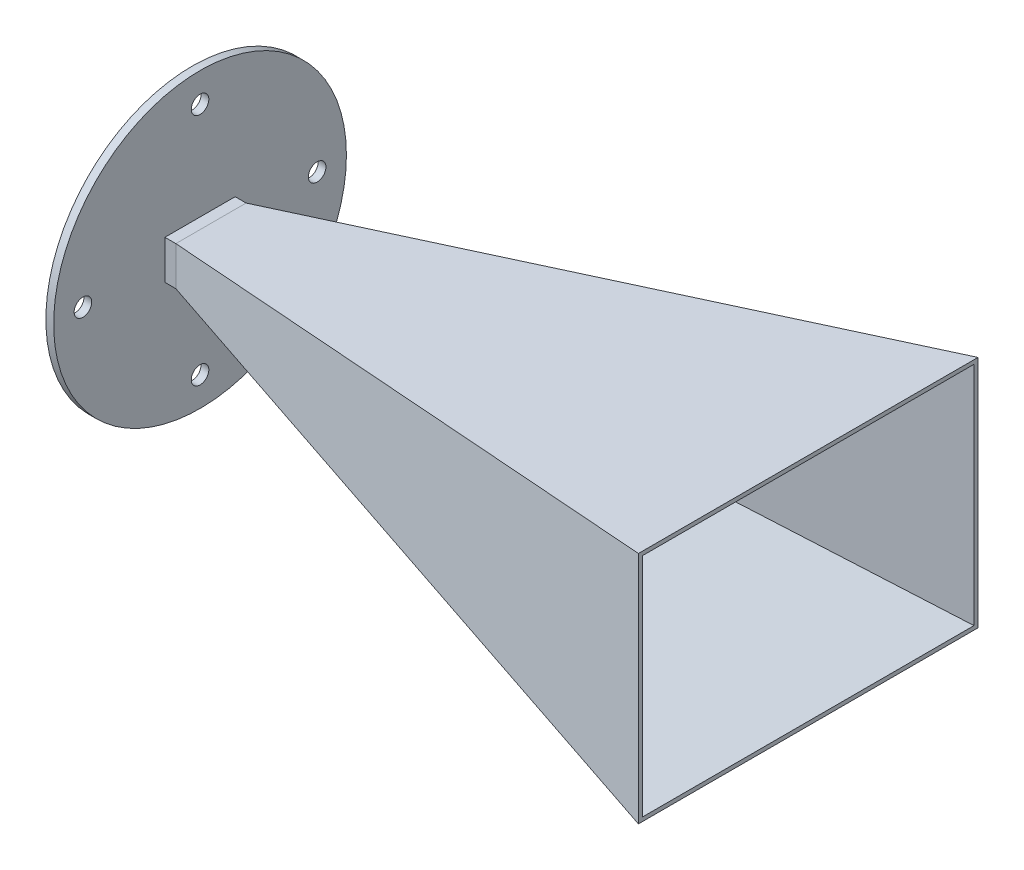
ISO-10303-21;
HEADER;
FILE_DESCRIPTION(('STEP AP214'),'2;1');
FILE_NAME('part.step','',(''),(''),'','','');
FILE_SCHEMA(('AUTOMOTIVE_DESIGN { 1 0 10303 214 1 1 1 1 }'));
ENDSEC;
DATA;
#1=APPLICATION_CONTEXT('core data for automotive mechanical design processes');
#2=APPLICATION_PROTOCOL_DEFINITION('international standard','automotive_design',2000,#1);
#3=PRODUCT_CONTEXT('',#1,'mechanical');
#4=PRODUCT('Part','Part','',(#3));
#5=PRODUCT_RELATED_PRODUCT_CATEGORY('part','',(#4));
#6=PRODUCT_DEFINITION_FORMATION('','',#4);
#7=PRODUCT_DEFINITION_CONTEXT('part definition',#1,'design');
#8=PRODUCT_DEFINITION('design','',#6,#7);
#9=PRODUCT_DEFINITION_SHAPE('','',#8);
#10=(LENGTH_UNIT() NAMED_UNIT(*) SI_UNIT(.MILLI.,.METRE.));
#11=(NAMED_UNIT(*) PLANE_ANGLE_UNIT() SI_UNIT($,.RADIAN.));
#12=(NAMED_UNIT(*) SI_UNIT($,.STERADIAN.) SOLID_ANGLE_UNIT());
#13=UNCERTAINTY_MEASURE_WITH_UNIT(LENGTH_MEASURE(1.E-05),#10,'distance_accuracy_value','');
#14=(GEOMETRIC_REPRESENTATION_CONTEXT(3) GLOBAL_UNCERTAINTY_ASSIGNED_CONTEXT((#13)) GLOBAL_UNIT_ASSIGNED_CONTEXT((#10,
#11,#12)) REPRESENTATION_CONTEXT('',''));
#15=CARTESIAN_POINT('',(0.,0.,0.));
#16=DIRECTION('',(0.,0.,1.));
#17=DIRECTION('',(1.,0.,0.));
#18=AXIS2_PLACEMENT_3D('',#15,#16,#17);
#19=CARTESIAN_POINT('',(2.,0.,0.));
#20=DIRECTION('',(1.,0.,0.));
#21=DIRECTION('',(0.,0.,-1.));
#22=AXIS2_PLACEMENT_3D('',#19,#20,#21);
#23=PLANE('',#22);
#24=CARTESIAN_POINT('',(2.,3.14233320495882E-13,-30.));
#25=DIRECTION('',(1.,0.,0.));
#26=DIRECTION('',(0.,0.,-1.));
#27=AXIS2_PLACEMENT_3D('',#24,#25,#26);
#28=CIRCLE('',#27,2.24999999999999);
#29=CARTESIAN_POINT('',(2.,3.14233320495882E-13,-32.25));
#30=VERTEX_POINT('',#29);
#31=EDGE_CURVE('E413',#30,#30,#28,.T.);
#32=ORIENTED_EDGE('',*,*,#31,.F.);
#33=EDGE_LOOP('',(#32));
#34=FACE_BOUND('',#33,.T.);
#35=CARTESIAN_POINT('',(2.,-30.,0.));
#36=DIRECTION('',(1.,0.,0.));
#37=DIRECTION('',(0.,0.,-1.));
#38=AXIS2_PLACEMENT_3D('',#35,#36,#37);
#39=CIRCLE('',#38,2.24999999999999);
#40=CARTESIAN_POINT('',(2.,-30.,-2.24999999999999));
#41=VERTEX_POINT('',#40);
#42=EDGE_CURVE('E407',#41,#41,#39,.T.);
#43=ORIENTED_EDGE('',*,*,#42,.F.);
#44=EDGE_LOOP('',(#43));
#45=FACE_BOUND('',#44,.T.);
#46=CARTESIAN_POINT('',(2.,-1.04744440165294E-13,30.));
#47=DIRECTION('',(1.,0.,0.));
#48=DIRECTION('',(0.,0.,-1.));
#49=AXIS2_PLACEMENT_3D('',#46,#47,#48);
#50=CIRCLE('',#49,2.24999999999999);
#51=CARTESIAN_POINT('',(2.,-1.04744440165294E-13,27.75));
#52=VERTEX_POINT('',#51);
#53=EDGE_CURVE('E401',#52,#52,#50,.T.);
#54=ORIENTED_EDGE('',*,*,#53,.F.);
#55=EDGE_LOOP('',(#54));
#56=FACE_BOUND('',#55,.T.);
#57=CARTESIAN_POINT('',(2.,30.,0.));
#58=DIRECTION('',(1.,0.,0.));
#59=DIRECTION('',(0.,0.,-1.));
#60=AXIS2_PLACEMENT_3D('',#57,#58,#59);
#61=CIRCLE('',#60,2.24999999999999);
#62=CARTESIAN_POINT('',(2.,30.,-2.24999999999999));
#63=VERTEX_POINT('',#62);
#64=EDGE_CURVE('E384',#63,#63,#61,.T.);
#65=ORIENTED_EDGE('',*,*,#64,.F.);
#66=EDGE_LOOP('',(#65));
#67=FACE_BOUND('',#66,.T.);
#68=CARTESIAN_POINT('',(2.,0.,0.));
#69=DIRECTION('',(1.,0.,0.));
#70=DIRECTION('',(0.,0.,-1.));
#71=AXIS2_PLACEMENT_3D('',#68,#69,#70);
#72=CIRCLE('',#71,37.5);
#73=CARTESIAN_POINT('',(2.,0.,-37.5));
#74=VERTEX_POINT('',#73);
#75=EDGE_CURVE('E12',#74,#74,#72,.T.);
#76=ORIENTED_EDGE('',*,*,#75,.T.);
#77=EDGE_LOOP('',(#76));
#78=FACE_BOUND('',#77,.T.);
#79=DIRECTION('',(0.,0.,-1.));
#80=VECTOR('',#79,1.);
#81=CARTESIAN_POINT('',(2.,-4.99999999999999,-9.00000000000001));
#82=LINE('',#81,#80);
#83=CARTESIAN_POINT('',(2.,-4.99999999999999,8.99999999999999));
#84=VERTEX_POINT('',#83);
#85=CARTESIAN_POINT('',(2.,-4.99999999999999,-9.00000000000001));
#86=VERTEX_POINT('',#85);
#87=EDGE_CURVE('E137',#84,#86,#82,.T.);
#88=ORIENTED_EDGE('',*,*,#87,.F.);
#89=DIRECTION('',(0.,-1.,0.));
#90=VECTOR('',#89,1.);
#91=CARTESIAN_POINT('',(2.,-4.99999999999999,8.99999999999999));
#92=LINE('',#91,#90);
#93=CARTESIAN_POINT('',(2.,5.00000000000001,8.99999999999999));
#94=VERTEX_POINT('',#93);
#95=EDGE_CURVE('E134',#94,#84,#92,.T.);
#96=ORIENTED_EDGE('',*,*,#95,.F.);
#97=DIRECTION('',(0.,0.,1.));
#98=VECTOR('',#97,1.);
#99=CARTESIAN_POINT('',(2.,5.00000000000001,-9.00000000000001));
#100=LINE('',#99,#98);
#101=CARTESIAN_POINT('',(2.,5.00000000000001,-9.00000000000001));
#102=VERTEX_POINT('',#101);
#103=EDGE_CURVE('E88',#102,#94,#100,.T.);
#104=ORIENTED_EDGE('',*,*,#103,.F.);
#105=DIRECTION('',(0.,1.,0.));
#106=VECTOR('',#105,1.);
#107=CARTESIAN_POINT('',(2.,-4.99999999999999,-9.00000000000001));
#108=LINE('',#107,#106);
#109=EDGE_CURVE('E139',#86,#102,#108,.T.);
#110=ORIENTED_EDGE('',*,*,#109,.F.);
#111=EDGE_LOOP('',(#88,#96,#104,#110));
#112=FACE_BOUND('',#111,.T.);
#113=ADVANCED_FACE('F41',(#34,#45,#56,#67,#78,#112),#23,.T.);
#114=CARTESIAN_POINT('',(2.,0.,0.));
#115=DIRECTION('',(-1.,0.,0.));
#116=DIRECTION('',(0.,0.,1.));
#117=AXIS2_PLACEMENT_3D('',#114,#115,#116);
#118=CYLINDRICAL_SURFACE('',#117,37.5);
#119=ORIENTED_EDGE('',*,*,#75,.F.);
#120=EDGE_LOOP('',(#119));
#121=FACE_BOUND('',#120,.T.);
#122=CARTESIAN_POINT('',(0.,0.,0.));
#123=DIRECTION('',(1.,0.,0.));
#124=DIRECTION('',(0.,0.,-1.));
#125=AXIS2_PLACEMENT_3D('',#122,#123,#124);
#126=CIRCLE('',#125,37.5);
#127=CARTESIAN_POINT('',(0.,0.,-37.5));
#128=VERTEX_POINT('',#127);
#129=EDGE_CURVE('E51',#128,#128,#126,.T.);
#130=ORIENTED_EDGE('',*,*,#129,.T.);
#131=EDGE_LOOP('',(#130));
#132=FACE_BOUND('',#131,.T.);
#133=ADVANCED_FACE('F43',(#121,#132),#118,.T.);
#134=CARTESIAN_POINT('',(0.,0.,0.));
#135=DIRECTION('',(1.,0.,0.));
#136=DIRECTION('',(0.,0.,-1.));
#137=AXIS2_PLACEMENT_3D('',#134,#135,#136);
#138=PLANE('',#137);
#139=CARTESIAN_POINT('',(0.,3.14233320495882E-13,-30.));
#140=DIRECTION('',(-1.,0.,0.));
#141=DIRECTION('',(0.,0.,1.));
#142=AXIS2_PLACEMENT_3D('',#139,#140,#141);
#143=CIRCLE('',#142,2.24999999999999);
#144=CARTESIAN_POINT('',(0.,3.14233320495882E-13,-27.75));
#145=VERTEX_POINT('',#144);
#146=EDGE_CURVE('E416',#145,#145,#143,.T.);
#147=ORIENTED_EDGE('',*,*,#146,.F.);
#148=EDGE_LOOP('',(#147));
#149=FACE_BOUND('',#148,.T.);
#150=CARTESIAN_POINT('',(0.,-30.,0.));
#151=DIRECTION('',(-1.,0.,0.));
#152=DIRECTION('',(0.,0.,1.));
#153=AXIS2_PLACEMENT_3D('',#150,#151,#152);
#154=CIRCLE('',#153,2.24999999999999);
#155=CARTESIAN_POINT('',(0.,-30.,2.24999999999999));
#156=VERTEX_POINT('',#155);
#157=EDGE_CURVE('E410',#156,#156,#154,.T.);
#158=ORIENTED_EDGE('',*,*,#157,.F.);
#159=EDGE_LOOP('',(#158));
#160=FACE_BOUND('',#159,.T.);
#161=CARTESIAN_POINT('',(0.,-1.04744440165294E-13,30.));
#162=DIRECTION('',(-1.,0.,0.));
#163=DIRECTION('',(0.,0.,1.));
#164=AXIS2_PLACEMENT_3D('',#161,#162,#163);
#165=CIRCLE('',#164,2.24999999999999);
#166=CARTESIAN_POINT('',(0.,-1.04744440165294E-13,32.25));
#167=VERTEX_POINT('',#166);
#168=EDGE_CURVE('E404',#167,#167,#165,.T.);
#169=ORIENTED_EDGE('',*,*,#168,.F.);
#170=EDGE_LOOP('',(#169));
#171=FACE_BOUND('',#170,.T.);
#172=CARTESIAN_POINT('',(0.,30.,0.));
#173=DIRECTION('',(-1.,0.,0.));
#174=DIRECTION('',(0.,0.,1.));
#175=AXIS2_PLACEMENT_3D('',#172,#173,#174);
#176=CIRCLE('',#175,2.24999999999999);
#177=CARTESIAN_POINT('',(0.,30.,2.24999999999999));
#178=VERTEX_POINT('',#177);
#179=EDGE_CURVE('E398',#178,#178,#176,.T.);
#180=ORIENTED_EDGE('',*,*,#179,.F.);
#181=EDGE_LOOP('',(#180));
#182=FACE_BOUND('',#181,.T.);
#183=DIRECTION('',(0.,0.,-1.));
#184=VECTOR('',#183,1.);
#185=CARTESIAN_POINT('',(0.,-4.,8.00000000000001));
#186=LINE('',#185,#184);
#187=CARTESIAN_POINT('',(0.,-4.,8.00000000000001));
#188=VERTEX_POINT('',#187);
#189=CARTESIAN_POINT('',(0.,-4.,-8.00000000000001));
#190=VERTEX_POINT('',#189);
#191=EDGE_CURVE('E299',#188,#190,#186,.T.);
#192=ORIENTED_EDGE('',*,*,#191,.T.);
#193=DIRECTION('',(0.,1.,0.));
#194=VECTOR('',#193,1.);
#195=CARTESIAN_POINT('',(0.,-4.,-8.00000000000001));
#196=LINE('',#195,#194);
#197=CARTESIAN_POINT('',(0.,4.,-8.00000000000001));
#198=VERTEX_POINT('',#197);
#199=EDGE_CURVE('E181',#190,#198,#196,.T.);
#200=ORIENTED_EDGE('',*,*,#199,.T.);
#201=DIRECTION('',(0.,0.,1.));
#202=VECTOR('',#201,1.);
#203=CARTESIAN_POINT('',(0.,4.,8.00000000000001));
#204=LINE('',#203,#202);
#205=CARTESIAN_POINT('',(0.,4.,8.00000000000001));
#206=VERTEX_POINT('',#205);
#207=EDGE_CURVE('E115',#198,#206,#204,.T.);
#208=ORIENTED_EDGE('',*,*,#207,.T.);
#209=DIRECTION('',(0.,-1.,0.));
#210=VECTOR('',#209,1.);
#211=CARTESIAN_POINT('',(0.,-4.,8.00000000000001));
#212=LINE('',#211,#210);
#213=EDGE_CURVE('E296',#206,#188,#212,.T.);
#214=ORIENTED_EDGE('',*,*,#213,.T.);
#215=EDGE_LOOP('',(#192,#200,#208,#214));
#216=FACE_BOUND('',#215,.T.);
#217=ORIENTED_EDGE('',*,*,#129,.F.);
#218=EDGE_LOOP('',(#217));
#219=FACE_BOUND('',#218,.T.);
#220=ADVANCED_FACE('F313',(#149,#160,#171,#182,#216,#219),#138,.F.);
#221=CARTESIAN_POINT('',(4.8,-4.99999999999999,8.99999999999999));
#222=DIRECTION('',(0.,0.,-1.));
#223=DIRECTION('',(-1.,0.,0.));
#224=AXIS2_PLACEMENT_3D('',#221,#222,#223);
#225=PLANE('',#224);
#226=ORIENTED_EDGE('',*,*,#95,.T.);
#227=DIRECTION('',(-1.,0.,0.));
#228=VECTOR('',#227,1.);
#229=CARTESIAN_POINT('',(4.8,-4.99999999999999,8.99999999999999));
#230=LINE('',#229,#228);
#231=CARTESIAN_POINT('',(4.80000000000019,-5.00000000000002,9.00000000000002));
#232=VERTEX_POINT('',#231);
#233=EDGE_CURVE('E146',#232,#84,#230,.T.);
#234=ORIENTED_EDGE('',*,*,#233,.F.);
#235=DIRECTION('',(0.,1.,0.));
#236=VECTOR('',#235,1.);
#237=CARTESIAN_POINT('',(4.8,0.,9.00000000000002));
#238=LINE('',#237,#236);
#239=CARTESIAN_POINT('',(4.80000000000019,5.00000000000002,9.00000000000002));
#240=VERTEX_POINT('',#239);
#241=EDGE_CURVE('E142',#240,#232,#238,.F.);
#242=ORIENTED_EDGE('',*,*,#241,.F.);
#243=DIRECTION('',(-1.,0.,0.));
#244=VECTOR('',#243,1.);
#245=CARTESIAN_POINT('',(4.8,5.00000000000001,8.99999999999999));
#246=LINE('',#245,#244);
#247=EDGE_CURVE('E147',#240,#94,#246,.T.);
#248=ORIENTED_EDGE('',*,*,#247,.T.);
#249=EDGE_LOOP('',(#226,#234,#242,#248));
#250=FACE_BOUND('',#249,.T.);
#251=ADVANCED_FACE('F424',(#250),#225,.F.);
#252=CARTESIAN_POINT('',(4.8,-4.99999999999999,-9.00000000000001));
#253=DIRECTION('',(0.,1.,0.));
#254=DIRECTION('',(0.,0.,1.));
#255=AXIS2_PLACEMENT_3D('',#252,#253,#254);
#256=PLANE('',#255);
#257=ORIENTED_EDGE('',*,*,#87,.T.);
#258=DIRECTION('',(-1.,0.,0.));
#259=VECTOR('',#258,1.);
#260=CARTESIAN_POINT('',(4.8,-4.99999999999999,-9.00000000000001));
#261=LINE('',#260,#259);
#262=CARTESIAN_POINT('',(4.8000000000002,-5.00000000000001,-9.00000000000004));
#263=VERTEX_POINT('',#262);
#264=EDGE_CURVE('E152',#263,#86,#261,.T.);
#265=ORIENTED_EDGE('',*,*,#264,.F.);
#266=DIRECTION('',(0.,0.,1.));
#267=VECTOR('',#266,1.);
#268=CARTESIAN_POINT('',(4.8,-5.00000000000001,0.));
#269=LINE('',#268,#267);
#270=EDGE_CURVE('E45',#232,#263,#269,.F.);
#271=ORIENTED_EDGE('',*,*,#270,.F.);
#272=ORIENTED_EDGE('',*,*,#233,.T.);
#273=EDGE_LOOP('',(#257,#265,#271,#272));
#274=FACE_BOUND('',#273,.T.);
#275=ADVANCED_FACE('F456',(#274),#256,.F.);
#276=CARTESIAN_POINT('',(4.8,-4.99999999999999,-9.00000000000001));
#277=DIRECTION('',(0.,0.,1.));
#278=DIRECTION('',(1.,0.,0.));
#279=AXIS2_PLACEMENT_3D('',#276,#277,#278);
#280=PLANE('',#279);
#281=ORIENTED_EDGE('',*,*,#109,.T.);
#282=DIRECTION('',(-1.,0.,0.));
#283=VECTOR('',#282,1.);
#284=CARTESIAN_POINT('',(4.8,5.00000000000001,-9.00000000000001));
#285=LINE('',#284,#283);
#286=CARTESIAN_POINT('',(4.8000000000002,5.00000000000003,-9.00000000000004));
#287=VERTEX_POINT('',#286);
#288=EDGE_CURVE('E149',#287,#102,#285,.T.);
#289=ORIENTED_EDGE('',*,*,#288,.F.);
#290=DIRECTION('',(0.,1.,0.));
#291=VECTOR('',#290,1.);
#292=CARTESIAN_POINT('',(4.8,0.,-9.00000000000001));
#293=LINE('',#292,#291);
#294=EDGE_CURVE('E159',#263,#287,#293,.T.);
#295=ORIENTED_EDGE('',*,*,#294,.F.);
#296=ORIENTED_EDGE('',*,*,#264,.T.);
#297=EDGE_LOOP('',(#281,#289,#295,#296));
#298=FACE_BOUND('',#297,.T.);
#299=ADVANCED_FACE('F460',(#298),#280,.F.);
#300=CARTESIAN_POINT('',(4.8,5.00000000000001,-9.00000000000001));
#301=DIRECTION('',(0.,-1.,0.));
#302=DIRECTION('',(0.,0.,-1.));
#303=AXIS2_PLACEMENT_3D('',#300,#301,#302);
#304=PLANE('',#303);
#305=ORIENTED_EDGE('',*,*,#103,.T.);
#306=ORIENTED_EDGE('',*,*,#247,.F.);
#307=DIRECTION('',(0.,0.,1.));
#308=VECTOR('',#307,1.);
#309=CARTESIAN_POINT('',(4.8,5.00000000000001,0.));
#310=LINE('',#309,#308);
#311=EDGE_CURVE('E150',#287,#240,#310,.T.);
#312=ORIENTED_EDGE('',*,*,#311,.F.);
#313=ORIENTED_EDGE('',*,*,#288,.T.);
#314=EDGE_LOOP('',(#305,#306,#312,#313));
#315=FACE_BOUND('',#314,.T.);
#316=ADVANCED_FACE('F463',(#315),#304,.F.);
#317=CARTESIAN_POINT('',(4.8,-4.,7.99999999999999));
#318=DIRECTION('',(0.,0.,-1.));
#319=DIRECTION('',(-1.,0.,0.));
#320=AXIS2_PLACEMENT_3D('',#317,#318,#319);
#321=PLANE('',#320);
#322=DIRECTION('',(-1.,0.,0.));
#323=VECTOR('',#322,1.);
#324=CARTESIAN_POINT('',(4.8,-4.,7.99999999999999));
#325=LINE('',#324,#323);
#326=CARTESIAN_POINT('',(4.8,-4.,7.99999999999999));
#327=VERTEX_POINT('',#326);
#328=EDGE_CURVE('E131',#327,#188,#325,.T.);
#329=ORIENTED_EDGE('',*,*,#328,.T.);
#330=ORIENTED_EDGE('',*,*,#213,.F.);
#331=DIRECTION('',(-1.,0.,0.));
#332=VECTOR('',#331,1.);
#333=CARTESIAN_POINT('',(4.8,4.,7.99999999999999));
#334=LINE('',#333,#332);
#335=CARTESIAN_POINT('',(4.8,4.,7.99999999999999));
#336=VERTEX_POINT('',#335);
#337=EDGE_CURVE('E60',#336,#206,#334,.T.);
#338=ORIENTED_EDGE('',*,*,#337,.F.);
#339=DIRECTION('',(0.,-1.,0.));
#340=VECTOR('',#339,1.);
#341=CARTESIAN_POINT('',(4.8,-4.,7.99999999999999));
#342=LINE('',#341,#340);
#343=EDGE_CURVE('E108',#336,#327,#342,.T.);
#344=ORIENTED_EDGE('',*,*,#343,.T.);
#345=EDGE_LOOP('',(#329,#330,#338,#344));
#346=FACE_BOUND('',#345,.T.);
#347=ADVANCED_FACE('F304',(#346),#321,.T.);
#348=CARTESIAN_POINT('',(4.8,-4.,-8.00000000000001));
#349=DIRECTION('',(0.,1.,0.));
#350=DIRECTION('',(0.,0.,1.));
#351=AXIS2_PLACEMENT_3D('',#348,#349,#350);
#352=PLANE('',#351);
#353=DIRECTION('',(-1.,0.,0.));
#354=VECTOR('',#353,1.);
#355=CARTESIAN_POINT('',(4.8,-4.,-8.00000000000001));
#356=LINE('',#355,#354);
#357=CARTESIAN_POINT('',(4.8,-4.,-8.00000000000001));
#358=VERTEX_POINT('',#357);
#359=EDGE_CURVE('E119',#358,#190,#356,.T.);
#360=ORIENTED_EDGE('',*,*,#359,.T.);
#361=ORIENTED_EDGE('',*,*,#191,.F.);
#362=ORIENTED_EDGE('',*,*,#328,.F.);
#363=DIRECTION('',(0.,0.,-1.));
#364=VECTOR('',#363,1.);
#365=CARTESIAN_POINT('',(4.8,-4.,-8.00000000000001));
#366=LINE('',#365,#364);
#367=EDGE_CURVE('E124',#327,#358,#366,.T.);
#368=ORIENTED_EDGE('',*,*,#367,.T.);
#369=EDGE_LOOP('',(#360,#361,#362,#368));
#370=FACE_BOUND('',#369,.T.);
#371=ADVANCED_FACE('F309',(#370),#352,.T.);
#372=CARTESIAN_POINT('',(4.8,-4.,-8.00000000000001));
#373=DIRECTION('',(0.,0.,1.));
#374=DIRECTION('',(1.,0.,0.));
#375=AXIS2_PLACEMENT_3D('',#372,#373,#374);
#376=PLANE('',#375);
#377=DIRECTION('',(-1.,0.,0.));
#378=VECTOR('',#377,1.);
#379=CARTESIAN_POINT('',(4.8,4.,-8.00000000000001));
#380=LINE('',#379,#378);
#381=CARTESIAN_POINT('',(4.8,4.,-8.00000000000001));
#382=VERTEX_POINT('',#381);
#383=EDGE_CURVE('E111',#382,#198,#380,.T.);
#384=ORIENTED_EDGE('',*,*,#383,.T.);
#385=ORIENTED_EDGE('',*,*,#199,.F.);
#386=ORIENTED_EDGE('',*,*,#359,.F.);
#387=DIRECTION('',(0.,1.,0.));
#388=VECTOR('',#387,1.);
#389=CARTESIAN_POINT('',(4.8,-4.,-8.00000000000001));
#390=LINE('',#389,#388);
#391=EDGE_CURVE('E104',#358,#382,#390,.T.);
#392=ORIENTED_EDGE('',*,*,#391,.T.);
#393=EDGE_LOOP('',(#384,#385,#386,#392));
#394=FACE_BOUND('',#393,.T.);
#395=ADVANCED_FACE('F122',(#394),#376,.T.);
#396=CARTESIAN_POINT('',(4.8,4.,-8.00000000000001));
#397=DIRECTION('',(0.,-1.,0.));
#398=DIRECTION('',(0.,0.,-1.));
#399=AXIS2_PLACEMENT_3D('',#396,#397,#398);
#400=PLANE('',#399);
#401=ORIENTED_EDGE('',*,*,#337,.T.);
#402=ORIENTED_EDGE('',*,*,#207,.F.);
#403=ORIENTED_EDGE('',*,*,#383,.F.);
#404=DIRECTION('',(0.,0.,1.));
#405=VECTOR('',#404,1.);
#406=CARTESIAN_POINT('',(4.8,4.,-8.00000000000001));
#407=LINE('',#406,#405);
#408=EDGE_CURVE('E98',#382,#336,#407,.T.);
#409=ORIENTED_EDGE('',*,*,#408,.T.);
#410=EDGE_LOOP('',(#401,#402,#403,#409));
#411=FACE_BOUND('',#410,.T.);
#412=ADVANCED_FACE('F112',(#411),#400,.T.);
#413=CARTESIAN_POINT('',(4.8,0.,0.));
#414=DIRECTION('',(-1.,0.,0.));
#415=DIRECTION('',(0.,0.,1.));
#416=AXIS2_PLACEMENT_3D('',#413,#414,#415);
#417=PLANE('',#416);
#418=DIRECTION('',(0.,1.,0.));
#419=VECTOR('',#418,1.);
#420=CARTESIAN_POINT('',(4.8,0.,7.97489228442692));
#421=LINE('',#420,#419);
#422=CARTESIAN_POINT('',(4.8,-3.98673836902202,7.97489228442692));
#423=VERTEX_POINT('',#422);
#424=CARTESIAN_POINT('',(4.8,3.98673836902202,7.97489228442692));
#425=VERTEX_POINT('',#424);
#426=EDGE_CURVE('E369',#423,#425,#421,.T.);
#427=ORIENTED_EDGE('',*,*,#426,.F.);
#428=DIRECTION('',(0.,0.,-1.));
#429=VECTOR('',#428,1.);
#430=CARTESIAN_POINT('',(4.8,-3.98673836902202,0.));
#431=LINE('',#430,#429);
#432=CARTESIAN_POINT('',(4.8,-3.98673836902202,-7.97489228442692));
#433=VERTEX_POINT('',#432);
#434=EDGE_CURVE('E372',#423,#433,#431,.T.);
#435=ORIENTED_EDGE('',*,*,#434,.T.);
#436=DIRECTION('',(0.,1.,0.));
#437=VECTOR('',#436,1.);
#438=CARTESIAN_POINT('',(4.8,0.,-7.97489228442692));
#439=LINE('',#438,#437);
#440=CARTESIAN_POINT('',(4.8,3.98673836902202,-7.97489228442692));
#441=VERTEX_POINT('',#440);
#442=EDGE_CURVE('E353',#433,#441,#439,.T.);
#443=ORIENTED_EDGE('',*,*,#442,.T.);
#444=DIRECTION('',(0.,0.,-1.));
#445=VECTOR('',#444,1.);
#446=CARTESIAN_POINT('',(4.8,3.98673836902202,0.));
#447=LINE('',#446,#445);
#448=EDGE_CURVE('E363',#425,#441,#447,.T.);
#449=ORIENTED_EDGE('',*,*,#448,.F.);
#450=EDGE_LOOP('',(#427,#435,#443,#449));
#451=FACE_BOUND('',#450,.T.);
#452=ORIENTED_EDGE('',*,*,#367,.F.);
#453=ORIENTED_EDGE('',*,*,#343,.F.);
#454=ORIENTED_EDGE('',*,*,#408,.F.);
#455=ORIENTED_EDGE('',*,*,#391,.F.);
#456=EDGE_LOOP('',(#452,#453,#454,#455));
#457=FACE_BOUND('',#456,.T.);
#458=ADVANCED_FACE('F101',(#451,#457),#417,.T.);
#459=CARTESIAN_POINT('',(157.8,0.,0.));
#460=DIRECTION('',(-1.,0.,0.));
#461=DIRECTION('',(0.,0.,1.));
#462=AXIS2_PLACEMENT_3D('',#459,#460,#461);
#463=PLANE('',#462);
#464=DIRECTION('',(0.,0.,-1.));
#465=VECTOR('',#464,1.);
#466=CARTESIAN_POINT('',(157.8,-28.986738369022,0.));
#467=LINE('',#466,#465);
#468=CARTESIAN_POINT('',(157.8,-28.986738369022,42.4748922844269));
#469=VERTEX_POINT('',#468);
#470=CARTESIAN_POINT('',(157.8,-28.986738369022,-42.4748922844269));
#471=VERTEX_POINT('',#470);
#472=EDGE_CURVE('E360',#469,#471,#467,.T.);
#473=ORIENTED_EDGE('',*,*,#472,.F.);
#474=DIRECTION('',(0.,1.,0.));
#475=VECTOR('',#474,1.);
#476=CARTESIAN_POINT('',(157.8,0.,42.4748922844269));
#477=LINE('',#476,#475);
#478=CARTESIAN_POINT('',(157.8,28.986738369022,42.4748922844269));
#479=VERTEX_POINT('',#478);
#480=EDGE_CURVE('E381',#469,#479,#477,.T.);
#481=ORIENTED_EDGE('',*,*,#480,.T.);
#482=DIRECTION('',(0.,0.,-1.));
#483=VECTOR('',#482,1.);
#484=CARTESIAN_POINT('',(157.8,28.986738369022,0.));
#485=LINE('',#484,#483);
#486=CARTESIAN_POINT('',(157.8,28.986738369022,-42.4748922844269));
#487=VERTEX_POINT('',#486);
#488=EDGE_CURVE('E379',#479,#487,#485,.T.);
#489=ORIENTED_EDGE('',*,*,#488,.T.);
#490=DIRECTION('',(0.,1.,0.));
#491=VECTOR('',#490,1.);
#492=CARTESIAN_POINT('',(157.8,0.,-42.4748922844269));
#493=LINE('',#492,#491);
#494=EDGE_CURVE('E356',#471,#487,#493,.T.);
#495=ORIENTED_EDGE('',*,*,#494,.F.);
#496=EDGE_LOOP('',(#473,#481,#489,#495));
#497=FACE_BOUND('',#496,.T.);
#498=DIRECTION('',(0.,1.,0.));
#499=VECTOR('',#498,1.);
#500=CARTESIAN_POINT('',(157.8,-30.,43.5));
#501=LINE('',#500,#499);
#502=CARTESIAN_POINT('',(157.8,-30.,43.5));
#503=VERTEX_POINT('',#502);
#504=CARTESIAN_POINT('',(157.8,30.,43.5));
#505=VERTEX_POINT('',#504);
#506=EDGE_CURVE('E198',#503,#505,#501,.T.);
#507=ORIENTED_EDGE('',*,*,#506,.F.);
#508=DIRECTION('',(0.,0.,-1.));
#509=VECTOR('',#508,1.);
#510=CARTESIAN_POINT('',(157.8,-30.,43.5));
#511=LINE('',#510,#509);
#512=CARTESIAN_POINT('',(157.8,-30.,-43.5));
#513=VERTEX_POINT('',#512);
#514=EDGE_CURVE('E176',#503,#513,#511,.T.);
#515=ORIENTED_EDGE('',*,*,#514,.T.);
#516=DIRECTION('',(0.,1.,0.));
#517=VECTOR('',#516,1.);
#518=CARTESIAN_POINT('',(157.8,-30.,-43.5));
#519=LINE('',#518,#517);
#520=CARTESIAN_POINT('',(157.8,30.,-43.5));
#521=VERTEX_POINT('',#520);
#522=EDGE_CURVE('E242',#513,#521,#519,.T.);
#523=ORIENTED_EDGE('',*,*,#522,.T.);
#524=DIRECTION('',(0.,0.,-1.));
#525=VECTOR('',#524,1.);
#526=CARTESIAN_POINT('',(157.8,30.,43.5));
#527=LINE('',#526,#525);
#528=EDGE_CURVE('E280',#505,#521,#527,.T.);
#529=ORIENTED_EDGE('',*,*,#528,.F.);
#530=EDGE_LOOP('',(#507,#515,#523,#529));
#531=FACE_BOUND('',#530,.T.);
#532=ADVANCED_FACE('F256',(#497,#531),#463,.F.);
#533=CARTESIAN_POINT('',(-0.67092452359158,4.10605808438047,0.));
#534=DIRECTION('',(0.1612601205996,-0.986911938069554,0.));
#535=DIRECTION('',(0.986911938069554,0.1612601205996,0.));
#536=AXIS2_PLACEMENT_3D('',#533,#534,#535);
#537=PLANE('',#536);
#538=DIRECTION('',(-0.963346002936267,-0.157409477603965,0.217225079093472));
#539=VECTOR('',#538,1.);
#540=CARTESIAN_POINT('',(157.8,30.,-43.5));
#541=LINE('',#540,#539);
#542=EDGE_CURVE('E241',#521,#287,#541,.T.);
#543=ORIENTED_EDGE('',*,*,#542,.T.);
#544=ORIENTED_EDGE('',*,*,#311,.T.);
#545=DIRECTION('',(-0.963346002936267,-0.157409477603965,-0.217225079093472));
#546=VECTOR('',#545,1.);
#547=CARTESIAN_POINT('',(157.8,30.,43.5));
#548=LINE('',#547,#546);
#549=EDGE_CURVE('E184',#505,#240,#548,.T.);
#550=ORIENTED_EDGE('',*,*,#549,.F.);
#551=ORIENTED_EDGE('',*,*,#528,.T.);
#552=EDGE_LOOP('',(#543,#544,#550,#551));
#553=FACE_BOUND('',#552,.T.);
#554=ADVANCED_FACE('F216',(#553),#537,.F.);
#555=CARTESIAN_POINT('',(-1.69896643190341,0.,7.53454678496297));
#556=DIRECTION('',(0.219967319192763,0.,-0.975507241637472));
#557=DIRECTION('',(-0.975507241637472,0.,-0.219967319192763));
#558=AXIS2_PLACEMENT_3D('',#555,#556,#557);
#559=PLANE('',#558);
#560=ORIENTED_EDGE('',*,*,#549,.T.);
#561=ORIENTED_EDGE('',*,*,#241,.T.);
#562=DIRECTION('',(-0.963346002936267,0.157409477603965,-0.217225079093472));
#563=VECTOR('',#562,1.);
#564=CARTESIAN_POINT('',(157.8,-30.,43.5));
#565=LINE('',#564,#563);
#566=EDGE_CURVE('E174',#503,#232,#565,.T.);
#567=ORIENTED_EDGE('',*,*,#566,.F.);
#568=ORIENTED_EDGE('',*,*,#506,.T.);
#569=EDGE_LOOP('',(#560,#561,#567,#568));
#570=FACE_BOUND('',#569,.T.);
#571=ADVANCED_FACE('F205',(#570),#559,.F.);
#572=CARTESIAN_POINT('',(-1.69896643190341,0.,-7.53454678496297));
#573=DIRECTION('',(-0.219967319192763,0.,-0.975507241637472));
#574=DIRECTION('',(-0.975507241637472,0.,0.219967319192763));
#575=AXIS2_PLACEMENT_3D('',#572,#573,#574);
#576=PLANE('',#575);
#577=DIRECTION('',(-0.963346002936267,0.157409477603965,0.217225079093472));
#578=VECTOR('',#577,1.);
#579=CARTESIAN_POINT('',(157.8,-30.,-43.5));
#580=LINE('',#579,#578);
#581=EDGE_CURVE('E172',#513,#263,#580,.T.);
#582=ORIENTED_EDGE('',*,*,#581,.T.);
#583=ORIENTED_EDGE('',*,*,#294,.T.);
#584=ORIENTED_EDGE('',*,*,#542,.F.);
#585=ORIENTED_EDGE('',*,*,#522,.F.);
#586=EDGE_LOOP('',(#582,#583,#584,#585));
#587=FACE_BOUND('',#586,.T.);
#588=ADVANCED_FACE('F215',(#587),#576,.T.);
#589=CARTESIAN_POINT('',(-0.670924523591579,-4.10605808438047,0.));
#590=DIRECTION('',(-0.1612601205996,-0.986911938069554,0.));
#591=DIRECTION('',(0.986911938069554,-0.1612601205996,0.));
#592=AXIS2_PLACEMENT_3D('',#589,#590,#591);
#593=PLANE('',#592);
#594=ORIENTED_EDGE('',*,*,#566,.T.);
#595=ORIENTED_EDGE('',*,*,#270,.T.);
#596=ORIENTED_EDGE('',*,*,#581,.F.);
#597=ORIENTED_EDGE('',*,*,#514,.F.);
#598=EDGE_LOOP('',(#594,#595,#596,#597));
#599=FACE_BOUND('',#598,.T.);
#600=ADVANCED_FACE('F169',(#599),#593,.T.);
#601=CARTESIAN_POINT('',(-0.50966440299198,3.11914614631092,0.));
#602=DIRECTION('',(0.1612601205996,-0.986911938069554,0.));
#603=DIRECTION('',(0.986911938069554,0.1612601205996,0.));
#604=AXIS2_PLACEMENT_3D('',#601,#602,#603);
#605=PLANE('',#604);
#606=DIRECTION('',(-0.963346002936267,-0.157409477603965,0.217225079093472));
#607=VECTOR('',#606,1.);
#608=CARTESIAN_POINT('',(-1.92796785572838,2.88739721612523,-6.45780149342934));
#609=LINE('',#608,#607);
#610=EDGE_CURVE('E348',#487,#441,#609,.T.);
#611=ORIENTED_EDGE('',*,*,#610,.F.);
#612=ORIENTED_EDGE('',*,*,#488,.F.);
#613=DIRECTION('',(-0.963346002936267,-0.157409477603965,-0.217225079093472));
#614=VECTOR('',#613,1.);
#615=CARTESIAN_POINT('',(-1.92796785572839,2.88739721612523,6.45780149342935));
#616=LINE('',#615,#614);
#617=EDGE_CURVE('E359',#479,#425,#616,.T.);
#618=ORIENTED_EDGE('',*,*,#617,.T.);
#619=ORIENTED_EDGE('',*,*,#448,.T.);
#620=EDGE_LOOP('',(#611,#612,#618,#619));
#621=FACE_BOUND('',#620,.T.);
#622=ADVANCED_FACE('F364',(#621),#605,.T.);
#623=CARTESIAN_POINT('',(-1.47899911271065,0.,6.5590395433255));
#624=DIRECTION('',(0.219967319192763,0.,-0.975507241637472));
#625=DIRECTION('',(-0.975507241637472,0.,-0.219967319192763));
#626=AXIS2_PLACEMENT_3D('',#623,#624,#625);
#627=PLANE('',#626);
#628=ORIENTED_EDGE('',*,*,#617,.F.);
#629=ORIENTED_EDGE('',*,*,#480,.F.);
#630=DIRECTION('',(-0.963346002936267,0.157409477603965,-0.217225079093472));
#631=VECTOR('',#630,1.);
#632=CARTESIAN_POINT('',(-1.92796785572839,-2.88739721612523,6.45780149342935));
#633=LINE('',#632,#631);
#634=EDGE_CURVE('E378',#469,#423,#633,.T.);
#635=ORIENTED_EDGE('',*,*,#634,.T.);
#636=ORIENTED_EDGE('',*,*,#426,.T.);
#637=EDGE_LOOP('',(#628,#629,#635,#636));
#638=FACE_BOUND('',#637,.T.);
#639=ADVANCED_FACE('F392',(#638),#627,.T.);
#640=CARTESIAN_POINT('',(-1.47899911271065,0.,-6.5590395433255));
#641=DIRECTION('',(-0.219967319192763,0.,-0.975507241637472));
#642=DIRECTION('',(-0.975507241637472,0.,0.219967319192763));
#643=AXIS2_PLACEMENT_3D('',#640,#641,#642);
#644=PLANE('',#643);
#645=DIRECTION('',(-0.963346002936267,0.157409477603965,0.217225079093472));
#646=VECTOR('',#645,1.);
#647=CARTESIAN_POINT('',(-1.92796785572838,-2.88739721612523,-6.45780149342934));
#648=LINE('',#647,#646);
#649=EDGE_CURVE('E388',#471,#433,#648,.T.);
#650=ORIENTED_EDGE('',*,*,#649,.F.);
#651=ORIENTED_EDGE('',*,*,#494,.T.);
#652=ORIENTED_EDGE('',*,*,#610,.T.);
#653=ORIENTED_EDGE('',*,*,#442,.F.);
#654=EDGE_LOOP('',(#650,#651,#652,#653));
#655=FACE_BOUND('',#654,.T.);
#656=ADVANCED_FACE('F351',(#655),#644,.F.);
#657=CARTESIAN_POINT('',(-0.509664402991979,-3.11914614631092,0.));
#658=DIRECTION('',(-0.1612601205996,-0.986911938069554,0.));
#659=DIRECTION('',(0.986911938069554,-0.1612601205996,0.));
#660=AXIS2_PLACEMENT_3D('',#657,#658,#659);
#661=PLANE('',#660);
#662=ORIENTED_EDGE('',*,*,#634,.F.);
#663=ORIENTED_EDGE('',*,*,#472,.T.);
#664=ORIENTED_EDGE('',*,*,#649,.T.);
#665=ORIENTED_EDGE('',*,*,#434,.F.);
#666=EDGE_LOOP('',(#662,#663,#664,#665));
#667=FACE_BOUND('',#666,.T.);
#668=ADVANCED_FACE('F266',(#667),#661,.F.);
#669=CARTESIAN_POINT('',(0.,30.,0.));
#670=DIRECTION('',(-1.,0.,0.));
#671=DIRECTION('',(0.,0.,1.));
#672=AXIS2_PLACEMENT_3D('',#669,#670,#671);
#673=CYLINDRICAL_SURFACE('',#672,2.24999999999999);
#674=ORIENTED_EDGE('',*,*,#64,.T.);
#675=EDGE_LOOP('',(#674));
#676=FACE_BOUND('',#675,.T.);
#677=ORIENTED_EDGE('',*,*,#179,.T.);
#678=EDGE_LOOP('',(#677));
#679=FACE_BOUND('',#678,.T.);
#680=ADVANCED_FACE('F431',(#676,#679),#673,.F.);
#681=CARTESIAN_POINT('',(0.,-1.04744440165294E-13,30.));
#682=DIRECTION('',(-1.,0.,0.));
#683=DIRECTION('',(0.,0.,1.));
#684=AXIS2_PLACEMENT_3D('',#681,#682,#683);
#685=CYLINDRICAL_SURFACE('',#684,2.24999999999999);
#686=ORIENTED_EDGE('',*,*,#53,.T.);
#687=EDGE_LOOP('',(#686));
#688=FACE_BOUND('',#687,.T.);
#689=ORIENTED_EDGE('',*,*,#168,.T.);
#690=EDGE_LOOP('',(#689));
#691=FACE_BOUND('',#690,.T.);
#692=ADVANCED_FACE('F433',(#688,#691),#685,.F.);
#693=CARTESIAN_POINT('',(0.,-30.,0.));
#694=DIRECTION('',(-1.,0.,0.));
#695=DIRECTION('',(0.,0.,1.));
#696=AXIS2_PLACEMENT_3D('',#693,#694,#695);
#697=CYLINDRICAL_SURFACE('',#696,2.24999999999999);
#698=ORIENTED_EDGE('',*,*,#42,.T.);
#699=EDGE_LOOP('',(#698));
#700=FACE_BOUND('',#699,.T.);
#701=ORIENTED_EDGE('',*,*,#157,.T.);
#702=EDGE_LOOP('',(#701));
#703=FACE_BOUND('',#702,.T.);
#704=ADVANCED_FACE('F440',(#700,#703),#697,.F.);
#705=CARTESIAN_POINT('',(0.,3.14233320495882E-13,-30.));
#706=DIRECTION('',(-1.,0.,0.));
#707=DIRECTION('',(0.,0.,1.));
#708=AXIS2_PLACEMENT_3D('',#705,#706,#707);
#709=CYLINDRICAL_SURFACE('',#708,2.24999999999999);
#710=ORIENTED_EDGE('',*,*,#31,.T.);
#711=EDGE_LOOP('',(#710));
#712=FACE_BOUND('',#711,.T.);
#713=ORIENTED_EDGE('',*,*,#146,.T.);
#714=EDGE_LOOP('',(#713));
#715=FACE_BOUND('',#714,.T.);
#716=ADVANCED_FACE('F420',(#712,#715),#709,.F.);
#717=CLOSED_SHELL('',(#113,#133,#220,#251,#275,#299,#316,#347,#371,#395,#412,#458,#532,#554,
#571,#588,#600,#622,#639,#656,#668,#680,#692,#704,#716));
#718=MANIFOLD_SOLID_BREP('B2',#717);
#719=ADVANCED_BREP_SHAPE_REPRESENTATION('',(#18,#718),#14);
#720=SHAPE_DEFINITION_REPRESENTATION(#9,#719);
ENDSEC;
END-ISO-10303-21;
